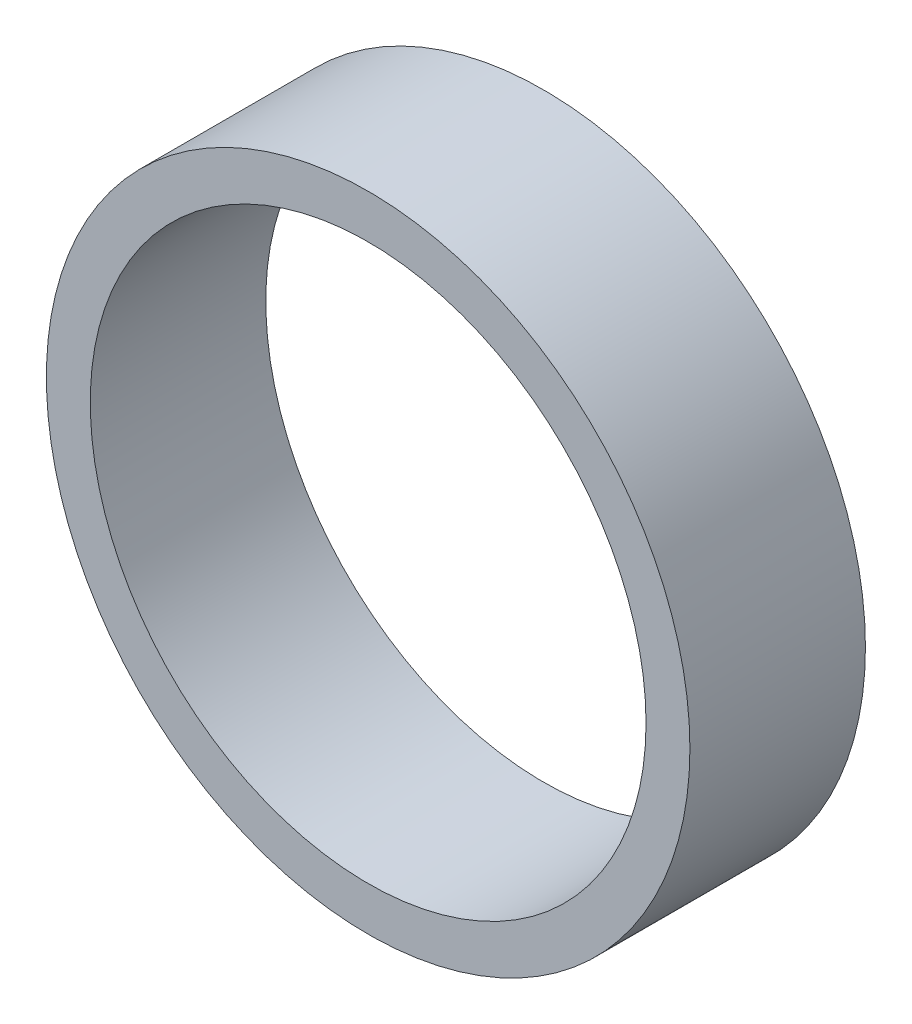
ISO-10303-21;
HEADER;
FILE_DESCRIPTION(('STEP AP214'),'2;1');
FILE_NAME('part.step','',(''),(''),'','','');
FILE_SCHEMA(('AUTOMOTIVE_DESIGN { 1 0 10303 214 1 1 1 1 }'));
ENDSEC;
DATA;
#1=APPLICATION_CONTEXT('core data for automotive mechanical design processes');
#2=APPLICATION_PROTOCOL_DEFINITION('international standard','automotive_design',2000,#1);
#3=PRODUCT_CONTEXT('',#1,'mechanical');
#4=PRODUCT('Part','Part','',(#3));
#5=PRODUCT_RELATED_PRODUCT_CATEGORY('part','',(#4));
#6=PRODUCT_DEFINITION_FORMATION('','',#4);
#7=PRODUCT_DEFINITION_CONTEXT('part definition',#1,'design');
#8=PRODUCT_DEFINITION('design','',#6,#7);
#9=PRODUCT_DEFINITION_SHAPE('','',#8);
#10=(LENGTH_UNIT() NAMED_UNIT(*) SI_UNIT(.MILLI.,.METRE.));
#11=(NAMED_UNIT(*) PLANE_ANGLE_UNIT() SI_UNIT($,.RADIAN.));
#12=(NAMED_UNIT(*) SI_UNIT($,.STERADIAN.) SOLID_ANGLE_UNIT());
#13=UNCERTAINTY_MEASURE_WITH_UNIT(LENGTH_MEASURE(1.E-05),#10,'distance_accuracy_value','');
#14=(GEOMETRIC_REPRESENTATION_CONTEXT(3) GLOBAL_UNCERTAINTY_ASSIGNED_CONTEXT((#13)) GLOBAL_UNIT_ASSIGNED_CONTEXT((#10,
#11,#12)) REPRESENTATION_CONTEXT('',''));
#15=CARTESIAN_POINT('',(0.,0.,0.));
#16=DIRECTION('',(0.,0.,1.));
#17=DIRECTION('',(1.,0.,0.));
#18=AXIS2_PLACEMENT_3D('',#15,#16,#17);
#19=CARTESIAN_POINT('',(0.,0.,6.));
#20=DIRECTION('',(0.,0.,1.));
#21=DIRECTION('',(1.,0.,0.));
#22=AXIS2_PLACEMENT_3D('',#19,#20,#21);
#23=PLANE('',#22);
#24=CARTESIAN_POINT('',(0.,0.,6.));
#25=DIRECTION('',(0.,0.,1.));
#26=DIRECTION('',(1.,0.,0.));
#27=AXIS2_PLACEMENT_3D('',#24,#25,#26);
#28=CIRCLE('',#27,11.);
#29=CARTESIAN_POINT('',(11.,0.,6.));
#30=VERTEX_POINT('',#29);
#31=EDGE_CURVE('E10',#30,#30,#28,.T.);
#32=ORIENTED_EDGE('',*,*,#31,.T.);
#33=EDGE_LOOP('',(#32));
#34=FACE_BOUND('',#33,.T.);
#35=CARTESIAN_POINT('',(0.,0.,6.));
#36=DIRECTION('',(0.,0.,1.));
#37=DIRECTION('',(1.,0.,0.));
#38=AXIS2_PLACEMENT_3D('',#35,#36,#37);
#39=CIRCLE('',#38,9.5);
#40=CARTESIAN_POINT('',(9.5,0.,6.));
#41=VERTEX_POINT('',#40);
#42=EDGE_CURVE('E41',#41,#41,#39,.T.);
#43=ORIENTED_EDGE('',*,*,#42,.F.);
#44=EDGE_LOOP('',(#43));
#45=FACE_BOUND('',#44,.T.);
#46=ADVANCED_FACE('F30',(#34,#45),#23,.T.);
#47=CARTESIAN_POINT('',(0.,0.,0.));
#48=DIRECTION('',(0.,0.,1.));
#49=DIRECTION('',(1.,0.,0.));
#50=AXIS2_PLACEMENT_3D('',#47,#48,#49);
#51=PLANE('',#50);
#52=CARTESIAN_POINT('',(0.,0.,0.));
#53=DIRECTION('',(0.,0.,1.));
#54=DIRECTION('',(1.,0.,0.));
#55=AXIS2_PLACEMENT_3D('',#52,#53,#54);
#56=CIRCLE('',#55,11.);
#57=CARTESIAN_POINT('',(11.,0.,0.));
#58=VERTEX_POINT('',#57);
#59=EDGE_CURVE('E34',#58,#58,#56,.T.);
#60=ORIENTED_EDGE('',*,*,#59,.F.);
#61=EDGE_LOOP('',(#60));
#62=FACE_BOUND('',#61,.T.);
#63=CARTESIAN_POINT('',(0.,0.,0.));
#64=DIRECTION('',(0.,0.,1.));
#65=DIRECTION('',(1.,0.,0.));
#66=AXIS2_PLACEMENT_3D('',#63,#64,#65);
#67=CIRCLE('',#66,9.5);
#68=CARTESIAN_POINT('',(9.5,0.,0.));
#69=VERTEX_POINT('',#68);
#70=EDGE_CURVE('E43',#69,#69,#67,.T.);
#71=ORIENTED_EDGE('',*,*,#70,.T.);
#72=EDGE_LOOP('',(#71));
#73=FACE_BOUND('',#72,.T.);
#74=ADVANCED_FACE('F53',(#62,#73),#51,.F.);
#75=CARTESIAN_POINT('',(0.,0.,6.));
#76=DIRECTION('',(0.,0.,-1.));
#77=DIRECTION('',(-1.,0.,0.));
#78=AXIS2_PLACEMENT_3D('',#75,#76,#77);
#79=CYLINDRICAL_SURFACE('',#78,11.);
#80=ORIENTED_EDGE('',*,*,#31,.F.);
#81=EDGE_LOOP('',(#80));
#82=FACE_BOUND('',#81,.T.);
#83=ORIENTED_EDGE('',*,*,#59,.T.);
#84=EDGE_LOOP('',(#83));
#85=FACE_BOUND('',#84,.T.);
#86=ADVANCED_FACE('F32',(#82,#85),#79,.T.);
#87=CARTESIAN_POINT('',(0.,0.,6.));
#88=DIRECTION('',(0.,0.,-1.));
#89=DIRECTION('',(-1.,0.,0.));
#90=AXIS2_PLACEMENT_3D('',#87,#88,#89);
#91=CYLINDRICAL_SURFACE('',#90,9.5);
#92=ORIENTED_EDGE('',*,*,#42,.T.);
#93=EDGE_LOOP('',(#92));
#94=FACE_BOUND('',#93,.T.);
#95=ORIENTED_EDGE('',*,*,#70,.F.);
#96=EDGE_LOOP('',(#95));
#97=FACE_BOUND('',#96,.T.);
#98=ADVANCED_FACE('F49',(#94,#97),#91,.F.);
#99=CLOSED_SHELL('',(#46,#74,#86,#98));
#100=MANIFOLD_SOLID_BREP('B2',#99);
#101=ADVANCED_BREP_SHAPE_REPRESENTATION('',(#18,#100),#14);
#102=SHAPE_DEFINITION_REPRESENTATION(#9,#101);
ENDSEC;
END-ISO-10303-21;
